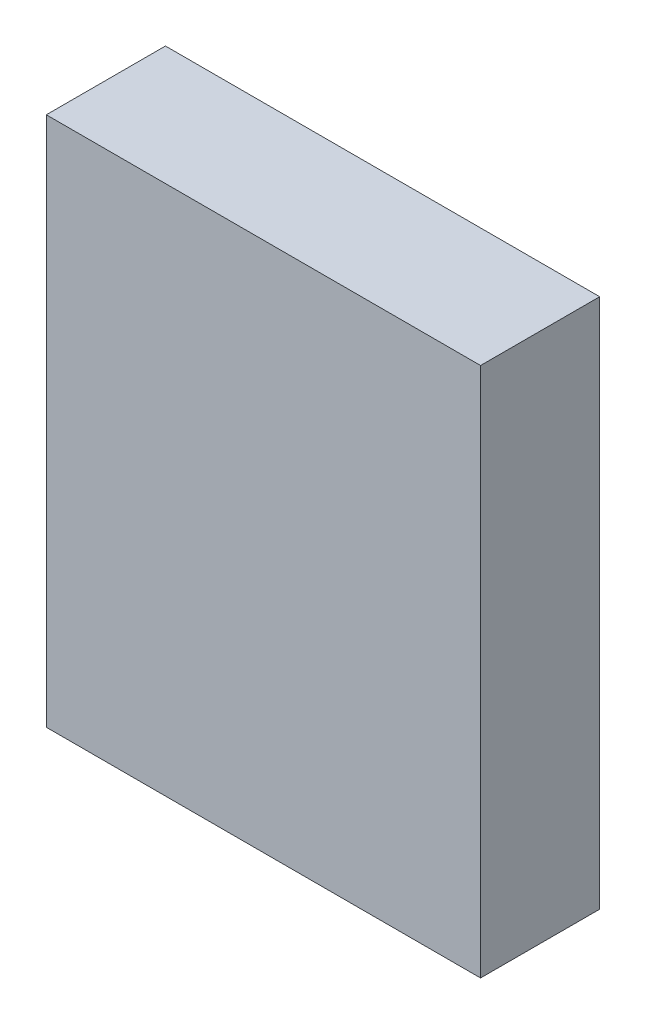
ISO-10303-21;
HEADER;
FILE_DESCRIPTION(('STEP AP214'),'2;1');
FILE_NAME('part.step','',(''),(''),'','','');
FILE_SCHEMA(('AUTOMOTIVE_DESIGN { 1 0 10303 214 1 1 1 1 }'));
ENDSEC;
DATA;
#1=APPLICATION_CONTEXT('core data for automotive mechanical design processes');
#2=APPLICATION_PROTOCOL_DEFINITION('international standard','automotive_design',2000,#1);
#3=PRODUCT_CONTEXT('',#1,'mechanical');
#4=PRODUCT('Part','Part','',(#3));
#5=PRODUCT_RELATED_PRODUCT_CATEGORY('part','',(#4));
#6=PRODUCT_DEFINITION_FORMATION('','',#4);
#7=PRODUCT_DEFINITION_CONTEXT('part definition',#1,'design');
#8=PRODUCT_DEFINITION('design','',#6,#7);
#9=PRODUCT_DEFINITION_SHAPE('','',#8);
#10=(LENGTH_UNIT() NAMED_UNIT(*) SI_UNIT(.MILLI.,.METRE.));
#11=(NAMED_UNIT(*) PLANE_ANGLE_UNIT() SI_UNIT($,.RADIAN.));
#12=(NAMED_UNIT(*) SI_UNIT($,.STERADIAN.) SOLID_ANGLE_UNIT());
#13=UNCERTAINTY_MEASURE_WITH_UNIT(LENGTH_MEASURE(1.E-05),#10,'distance_accuracy_value','');
#14=(GEOMETRIC_REPRESENTATION_CONTEXT(3) GLOBAL_UNCERTAINTY_ASSIGNED_CONTEXT((#13)) GLOBAL_UNIT_ASSIGNED_CONTEXT((#10,
#11,#12)) REPRESENTATION_CONTEXT('',''));
#15=CARTESIAN_POINT('',(0.,0.,0.));
#16=DIRECTION('',(0.,0.,1.));
#17=DIRECTION('',(1.,0.,0.));
#18=AXIS2_PLACEMENT_3D('',#15,#16,#17);
#19=CARTESIAN_POINT('',(-98.525,9.726246599057,-21.79183441299));
#20=DIRECTION('',(0.,0.,-1.));
#21=DIRECTION('',(-1.,0.,0.));
#22=AXIS2_PLACEMENT_3D('',#19,#20,#21);
#23=PLANE('',#22);
#24=DIRECTION('',(1.,0.,0.));
#25=VECTOR('',#24,1.);
#26=CARTESIAN_POINT('',(-98.525,7.313735262584,-21.79183441299));
#27=LINE('',#26,#25);
#28=CARTESIAN_POINT('',(-96.55,7.313735262584,-21.79183441299));
#29=VERTEX_POINT('',#28);
#30=CARTESIAN_POINT('',(-100.5,7.313735262584,-21.79183441299));
#31=VERTEX_POINT('',#30);
#32=EDGE_CURVE('E20',#29,#31,#27,.F.);
#33=ORIENTED_EDGE('',*,*,#32,.T.);
#34=DIRECTION('',(0.,1.,0.));
#35=VECTOR('',#34,1.);
#36=CARTESIAN_POINT('',(-100.5,-54.,-21.79183441299));
#37=LINE('',#36,#35);
#38=CARTESIAN_POINT('',(-100.5,12.1387579355305,-21.79183441299));
#39=VERTEX_POINT('',#38);
#40=EDGE_CURVE('E80',#39,#31,#37,.F.);
#41=ORIENTED_EDGE('',*,*,#40,.F.);
#42=DIRECTION('',(-1.,4.654504629821E-13,0.));
#43=VECTOR('',#42,1.);
#44=CARTESIAN_POINT('',(-98.525,12.13875793553,-21.79183441299));
#45=LINE('',#44,#43);
#46=CARTESIAN_POINT('',(-96.55,12.1387579355298,-21.79183441299));
#47=VERTEX_POINT('',#46);
#48=EDGE_CURVE('E61',#47,#39,#45,.T.);
#49=ORIENTED_EDGE('',*,*,#48,.F.);
#50=DIRECTION('',(0.,1.,0.));
#51=VECTOR('',#50,1.);
#52=CARTESIAN_POINT('',(-96.55,-54.,-21.79183441299));
#53=LINE('',#52,#51);
#54=EDGE_CURVE('E55',#47,#29,#53,.F.);
#55=ORIENTED_EDGE('',*,*,#54,.T.);
#56=EDGE_LOOP('',(#33,#41,#49,#55));
#57=FACE_BOUND('',#56,.T.);
#58=ADVANCED_FACE('F17',(#57),#23,.T.);
#59=CARTESIAN_POINT('',(-98.525,7.313735262584,-21.25));
#60=DIRECTION('',(0.,1.,0.));
#61=DIRECTION('',(0.,0.,1.));
#62=AXIS2_PLACEMENT_3D('',#59,#60,#61);
#63=PLANE('',#62);
#64=DIRECTION('',(0.,0.,1.));
#65=VECTOR('',#64,1.);
#66=CARTESIAN_POINT('',(-96.55,7.313735262584,-68.8));
#67=LINE('',#66,#65);
#68=CARTESIAN_POINT('',(-96.55,7.313735262584,-20.70816558701));
#69=VERTEX_POINT('',#68);
#70=EDGE_CURVE('E63',#29,#69,#67,.T.);
#71=ORIENTED_EDGE('',*,*,#70,.T.);
#72=DIRECTION('',(1.,0.,0.));
#73=VECTOR('',#72,1.);
#74=CARTESIAN_POINT('',(-98.525,7.313735262584,-20.70816558701));
#75=LINE('',#74,#73);
#76=CARTESIAN_POINT('',(-100.5,7.313735262584,-20.70816558701));
#77=VERTEX_POINT('',#76);
#78=EDGE_CURVE('E83',#77,#69,#75,.T.);
#79=ORIENTED_EDGE('',*,*,#78,.F.);
#80=DIRECTION('',(0.,0.,1.));
#81=VECTOR('',#80,1.);
#82=CARTESIAN_POINT('',(-100.5,7.313735262584,-68.8));
#83=LINE('',#82,#81);
#84=EDGE_CURVE('E68',#31,#77,#83,.T.);
#85=ORIENTED_EDGE('',*,*,#84,.F.);
#86=ORIENTED_EDGE('',*,*,#32,.F.);
#87=EDGE_LOOP('',(#71,#79,#85,#86));
#88=FACE_BOUND('',#87,.T.);
#89=ADVANCED_FACE('F65',(#88),#63,.F.);
#90=CARTESIAN_POINT('',(-96.55,-54.,-68.8));
#91=DIRECTION('',(-1.,0.,0.));
#92=DIRECTION('',(0.,0.,1.));
#93=AXIS2_PLACEMENT_3D('',#90,#91,#92);
#94=PLANE('',#93);
#95=ORIENTED_EDGE('',*,*,#54,.F.);
#96=DIRECTION('',(0.,0.,1.));
#97=VECTOR('',#96,1.);
#98=CARTESIAN_POINT('',(-96.55,12.1387579355291,-21.25));
#99=LINE('',#98,#97);
#100=CARTESIAN_POINT('',(-96.55,12.1387579355298,-20.70816558701));
#101=VERTEX_POINT('',#100);
#102=EDGE_CURVE('E74',#101,#47,#99,.F.);
#103=ORIENTED_EDGE('',*,*,#102,.F.);
#104=DIRECTION('',(0.,1.,0.));
#105=VECTOR('',#104,1.);
#106=CARTESIAN_POINT('',(-96.55,9.726246599057,-20.70816558701));
#107=LINE('',#106,#105);
#108=EDGE_CURVE('E72',#69,#101,#107,.T.);
#109=ORIENTED_EDGE('',*,*,#108,.F.);
#110=ORIENTED_EDGE('',*,*,#70,.F.);
#111=EDGE_LOOP('',(#95,#103,#109,#110));
#112=FACE_BOUND('',#111,.T.);
#113=ADVANCED_FACE('F70',(#112),#94,.F.);
#114=CARTESIAN_POINT('',(-98.525,12.13875793553,-21.25));
#115=DIRECTION('',(4.654504629821E-13,1.,0.));
#116=DIRECTION('',(-1.,4.654504629821E-13,0.));
#117=AXIS2_PLACEMENT_3D('',#114,#115,#116);
#118=PLANE('',#117);
#119=ORIENTED_EDGE('',*,*,#48,.T.);
#120=DIRECTION('',(0.,0.,1.));
#121=VECTOR('',#120,1.);
#122=CARTESIAN_POINT('',(-100.5,12.13875793553,-68.8));
#123=LINE('',#122,#121);
#124=CARTESIAN_POINT('',(-100.5,12.1387579355305,-20.70816558701));
#125=VERTEX_POINT('',#124);
#126=EDGE_CURVE('E35',#125,#39,#123,.F.);
#127=ORIENTED_EDGE('',*,*,#126,.F.);
#128=DIRECTION('',(1.,0.,0.));
#129=VECTOR('',#128,1.);
#130=CARTESIAN_POINT('',(-98.525,12.13875793553,-20.70816558701));
#131=LINE('',#130,#129);
#132=EDGE_CURVE('E26',#101,#125,#131,.F.);
#133=ORIENTED_EDGE('',*,*,#132,.F.);
#134=ORIENTED_EDGE('',*,*,#102,.T.);
#135=EDGE_LOOP('',(#119,#127,#133,#134));
#136=FACE_BOUND('',#135,.T.);
#137=ADVANCED_FACE('F89',(#136),#118,.T.);
#138=CARTESIAN_POINT('',(-100.5,-54.,-68.8));
#139=DIRECTION('',(-1.,0.,0.));
#140=DIRECTION('',(0.,0.,1.));
#141=AXIS2_PLACEMENT_3D('',#138,#139,#140);
#142=PLANE('',#141);
#143=ORIENTED_EDGE('',*,*,#84,.T.);
#144=DIRECTION('',(0.,1.,0.));
#145=VECTOR('',#144,1.);
#146=CARTESIAN_POINT('',(-100.5,9.726246599057,-20.70816558701));
#147=LINE('',#146,#145);
#148=EDGE_CURVE('E11',#125,#77,#147,.F.);
#149=ORIENTED_EDGE('',*,*,#148,.F.);
#150=ORIENTED_EDGE('',*,*,#126,.T.);
#151=ORIENTED_EDGE('',*,*,#40,.T.);
#152=EDGE_LOOP('',(#143,#149,#150,#151));
#153=FACE_BOUND('',#152,.T.);
#154=ADVANCED_FACE('F91',(#153),#142,.T.);
#155=CARTESIAN_POINT('',(-98.525,9.726246599057,-20.70816558701));
#156=DIRECTION('',(0.,0.,1.));
#157=DIRECTION('',(1.,0.,0.));
#158=AXIS2_PLACEMENT_3D('',#155,#156,#157);
#159=PLANE('',#158);
#160=ORIENTED_EDGE('',*,*,#132,.T.);
#161=ORIENTED_EDGE('',*,*,#148,.T.);
#162=ORIENTED_EDGE('',*,*,#78,.T.);
#163=ORIENTED_EDGE('',*,*,#108,.T.);
#164=EDGE_LOOP('',(#160,#161,#162,#163));
#165=FACE_BOUND('',#164,.T.);
#166=ADVANCED_FACE('F88',(#165),#159,.T.);
#167=CLOSED_SHELL('',(#58,#89,#113,#137,#154,#166));
#168=MANIFOLD_SOLID_BREP('B1',#167);
#169=ADVANCED_BREP_SHAPE_REPRESENTATION('',(#18,#168),#14);
#170=SHAPE_DEFINITION_REPRESENTATION(#9,#169);
ENDSEC;
END-ISO-10303-21;
